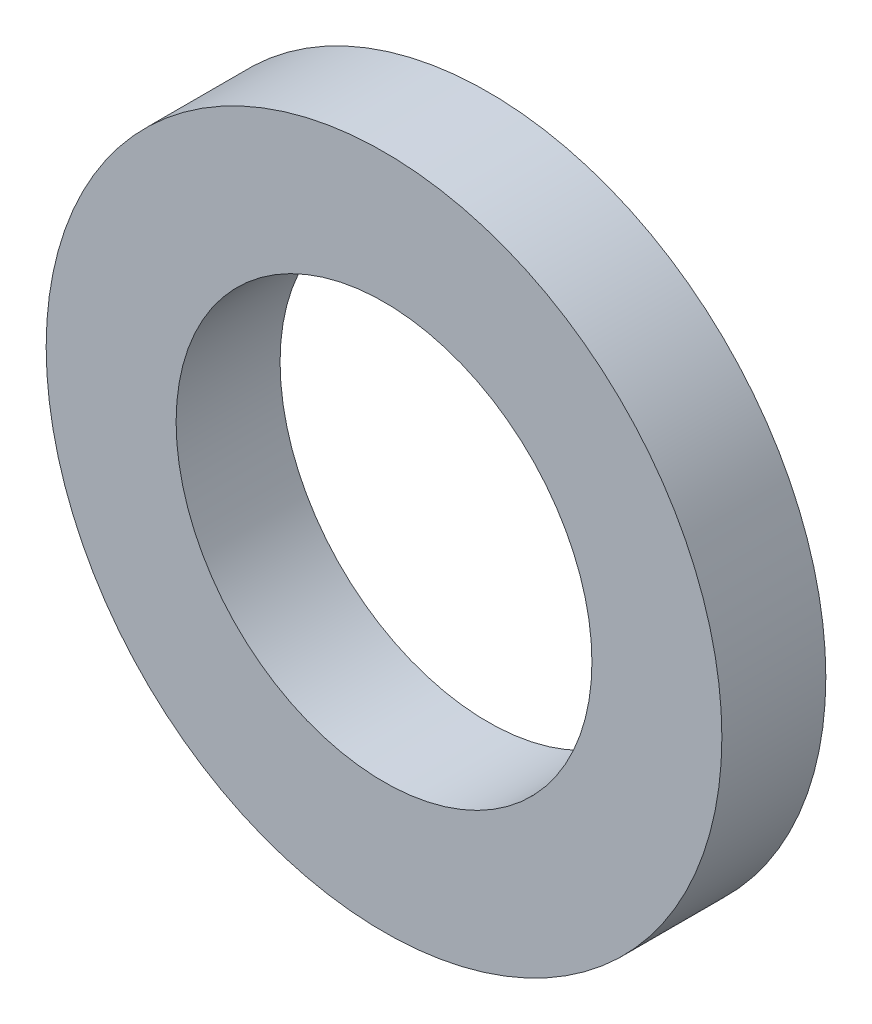
ISO-10303-21;
HEADER;
FILE_DESCRIPTION(('STEP AP214'),'2;1');
FILE_NAME('part.step','',(''),(''),'','','');
FILE_SCHEMA(('AUTOMOTIVE_DESIGN { 1 0 10303 214 1 1 1 1 }'));
ENDSEC;
DATA;
#1=APPLICATION_CONTEXT('core data for automotive mechanical design processes');
#2=APPLICATION_PROTOCOL_DEFINITION('international standard','automotive_design',2000,#1);
#3=PRODUCT_CONTEXT('',#1,'mechanical');
#4=PRODUCT('Part','Part','',(#3));
#5=PRODUCT_RELATED_PRODUCT_CATEGORY('part','',(#4));
#6=PRODUCT_DEFINITION_FORMATION('','',#4);
#7=PRODUCT_DEFINITION_CONTEXT('part definition',#1,'design');
#8=PRODUCT_DEFINITION('design','',#6,#7);
#9=PRODUCT_DEFINITION_SHAPE('','',#8);
#10=(LENGTH_UNIT() NAMED_UNIT(*) SI_UNIT(.MILLI.,.METRE.));
#11=(NAMED_UNIT(*) PLANE_ANGLE_UNIT() SI_UNIT($,.RADIAN.));
#12=(NAMED_UNIT(*) SI_UNIT($,.STERADIAN.) SOLID_ANGLE_UNIT());
#13=UNCERTAINTY_MEASURE_WITH_UNIT(LENGTH_MEASURE(1.E-05),#10,'distance_accuracy_value','');
#14=(GEOMETRIC_REPRESENTATION_CONTEXT(3) GLOBAL_UNCERTAINTY_ASSIGNED_CONTEXT((#13)) GLOBAL_UNIT_ASSIGNED_CONTEXT((#10,
#11,#12)) REPRESENTATION_CONTEXT('',''));
#15=CARTESIAN_POINT('',(0.,0.,0.));
#16=DIRECTION('',(0.,0.,1.));
#17=DIRECTION('',(1.,0.,0.));
#18=AXIS2_PLACEMENT_3D('',#15,#16,#17);
#19=CARTESIAN_POINT('',(0.,0.,0.));
#20=DIRECTION('',(0.,0.,-1.));
#21=DIRECTION('',(1.,0.,0.));
#22=AXIS2_PLACEMENT_3D('',#19,#20,#21);
#23=CYLINDRICAL_SURFACE('',#22,0.6499987);
#24=CARTESIAN_POINT('',(0.,0.,0.1999996));
#25=DIRECTION('',(0.,0.,1.));
#26=DIRECTION('',(1.,0.,0.));
#27=AXIS2_PLACEMENT_3D('',#24,#25,#26);
#28=CIRCLE('',#27,0.6499987);
#29=CARTESIAN_POINT('',(0.6499987,0.,0.1999996));
#30=VERTEX_POINT('',#29);
#31=EDGE_CURVE('E11',#30,#30,#28,.T.);
#32=ORIENTED_EDGE('',*,*,#31,.F.);
#33=DIRECTION('',(0.,0.,1.));
#34=VECTOR('',#33,1.);
#35=CARTESIAN_POINT('',(0.6499987,0.,0.));
#36=LINE('',#35,#34);
#37=CARTESIAN_POINT('',(0.6499987,0.,0.));
#38=VERTEX_POINT('',#37);
#39=EDGE_CURVE('E24',#38,#30,#36,.T.);
#40=ORIENTED_EDGE('',*,*,#39,.F.);
#41=CARTESIAN_POINT('',(0.,0.,0.));
#42=DIRECTION('',(0.,0.,1.));
#43=DIRECTION('',(1.,0.,0.));
#44=AXIS2_PLACEMENT_3D('',#41,#42,#43);
#45=CIRCLE('',#44,0.6499987);
#46=EDGE_CURVE('E46',#38,#38,#45,.T.);
#47=ORIENTED_EDGE('',*,*,#46,.T.);
#48=ORIENTED_EDGE('',*,*,#39,.T.);
#49=EDGE_LOOP('',(#32,#40,#47,#48));
#50=FACE_BOUND('',#49,.T.);
#51=ADVANCED_FACE('F17',(#50),#23,.T.);
#52=CARTESIAN_POINT('',(0.,0.,0.));
#53=DIRECTION('',(0.,0.,-1.));
#54=DIRECTION('',(1.,0.,0.));
#55=AXIS2_PLACEMENT_3D('',#52,#53,#54);
#56=CYLINDRICAL_SURFACE('',#55,0.3999992);
#57=DIRECTION('',(0.,0.,1.));
#58=VECTOR('',#57,1.);
#59=CARTESIAN_POINT('',(0.3999992,0.,0.));
#60=LINE('',#59,#58);
#61=CARTESIAN_POINT('',(0.3999992,0.,0.));
#62=VERTEX_POINT('',#61);
#63=CARTESIAN_POINT('',(0.3999992,0.,0.1999996));
#64=VERTEX_POINT('',#63);
#65=EDGE_CURVE('E40',#62,#64,#60,.T.);
#66=ORIENTED_EDGE('',*,*,#65,.T.);
#67=CARTESIAN_POINT('',(0.,0.,0.1999996));
#68=DIRECTION('',(0.,0.,1.));
#69=DIRECTION('',(1.,0.,0.));
#70=AXIS2_PLACEMENT_3D('',#67,#68,#69);
#71=CIRCLE('',#70,0.3999992);
#72=EDGE_CURVE('E45',#64,#64,#71,.T.);
#73=ORIENTED_EDGE('',*,*,#72,.T.);
#74=ORIENTED_EDGE('',*,*,#65,.F.);
#75=CARTESIAN_POINT('',(0.,0.,0.));
#76=DIRECTION('',(0.,0.,1.));
#77=DIRECTION('',(1.,0.,0.));
#78=AXIS2_PLACEMENT_3D('',#75,#76,#77);
#79=CIRCLE('',#78,0.3999992);
#80=EDGE_CURVE('E43',#62,#62,#79,.T.);
#81=ORIENTED_EDGE('',*,*,#80,.F.);
#82=EDGE_LOOP('',(#66,#73,#74,#81));
#83=FACE_BOUND('',#82,.T.);
#84=ADVANCED_FACE('F42',(#83),#56,.F.);
#85=CARTESIAN_POINT('',(0.6499987,0.,0.));
#86=DIRECTION('',(0.,0.,-1.));
#87=DIRECTION('',(-1.,0.,0.));
#88=AXIS2_PLACEMENT_3D('',#85,#86,#87);
#89=PLANE('',#88);
#90=ORIENTED_EDGE('',*,*,#46,.F.);
#91=EDGE_LOOP('',(#90));
#92=FACE_BOUND('',#91,.T.);
#93=ORIENTED_EDGE('',*,*,#80,.T.);
#94=EDGE_LOOP('',(#93));
#95=FACE_BOUND('',#94,.T.);
#96=ADVANCED_FACE('F49',(#92,#95),#89,.T.);
#97=CARTESIAN_POINT('',(0.6499987,0.,0.1999996));
#98=DIRECTION('',(0.,0.,-1.));
#99=DIRECTION('',(-1.,0.,0.));
#100=AXIS2_PLACEMENT_3D('',#97,#98,#99);
#101=PLANE('',#100);
#102=ORIENTED_EDGE('',*,*,#31,.T.);
#103=EDGE_LOOP('',(#102));
#104=FACE_BOUND('',#103,.T.);
#105=ORIENTED_EDGE('',*,*,#72,.F.);
#106=EDGE_LOOP('',(#105));
#107=FACE_BOUND('',#106,.T.);
#108=ADVANCED_FACE('F56',(#104,#107),#101,.F.);
#109=CLOSED_SHELL('',(#51,#84,#96,#108));
#110=MANIFOLD_SOLID_BREP('B1',#109);
#111=ADVANCED_BREP_SHAPE_REPRESENTATION('',(#18,#110),#14);
#112=SHAPE_DEFINITION_REPRESENTATION(#9,#111);
ENDSEC;
END-ISO-10303-21;
